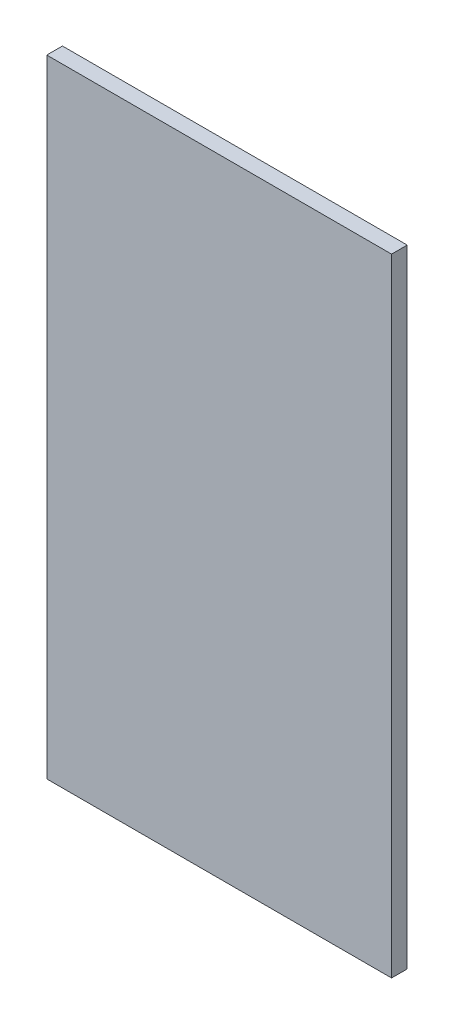
ISO-10303-21;
HEADER;
FILE_DESCRIPTION(('STEP AP214'),'2;1');
FILE_NAME('part.step','',(''),(''),'','','');
FILE_SCHEMA(('AUTOMOTIVE_DESIGN { 1 0 10303 214 1 1 1 1 }'));
ENDSEC;
DATA;
#1=APPLICATION_CONTEXT('core data for automotive mechanical design processes');
#2=APPLICATION_PROTOCOL_DEFINITION('international standard','automotive_design',2000,#1);
#3=PRODUCT_CONTEXT('',#1,'mechanical');
#4=PRODUCT('Part','Part','',(#3));
#5=PRODUCT_RELATED_PRODUCT_CATEGORY('part','',(#4));
#6=PRODUCT_DEFINITION_FORMATION('','',#4);
#7=PRODUCT_DEFINITION_CONTEXT('part definition',#1,'design');
#8=PRODUCT_DEFINITION('design','',#6,#7);
#9=PRODUCT_DEFINITION_SHAPE('','',#8);
#10=(LENGTH_UNIT() NAMED_UNIT(*) SI_UNIT(.MILLI.,.METRE.));
#11=(NAMED_UNIT(*) PLANE_ANGLE_UNIT() SI_UNIT($,.RADIAN.));
#12=(NAMED_UNIT(*) SI_UNIT($,.STERADIAN.) SOLID_ANGLE_UNIT());
#13=UNCERTAINTY_MEASURE_WITH_UNIT(LENGTH_MEASURE(1.E-05),#10,'distance_accuracy_value','');
#14=(GEOMETRIC_REPRESENTATION_CONTEXT(3) GLOBAL_UNCERTAINTY_ASSIGNED_CONTEXT((#13)) GLOBAL_UNIT_ASSIGNED_CONTEXT((#10,
#11,#12)) REPRESENTATION_CONTEXT('',''));
#15=CARTESIAN_POINT('',(0.,0.,0.));
#16=DIRECTION('',(0.,0.,1.));
#17=DIRECTION('',(1.,0.,0.));
#18=AXIS2_PLACEMENT_3D('',#15,#16,#17);
#19=CARTESIAN_POINT('',(110.,-200.,10.));
#20=DIRECTION('',(-1.,0.,0.));
#21=DIRECTION('',(0.,0.,1.));
#22=AXIS2_PLACEMENT_3D('',#19,#20,#21);
#23=PLANE('',#22);
#24=DIRECTION('',(0.,1.,0.));
#25=VECTOR('',#24,1.);
#26=CARTESIAN_POINT('',(110.,-200.,0.));
#27=LINE('',#26,#25);
#28=CARTESIAN_POINT('',(110.,-200.,0.));
#29=VERTEX_POINT('',#28);
#30=CARTESIAN_POINT('',(110.,200.,0.));
#31=VERTEX_POINT('',#30);
#32=EDGE_CURVE('E113',#29,#31,#27,.T.);
#33=ORIENTED_EDGE('',*,*,#32,.T.);
#34=DIRECTION('',(0.,0.,-1.));
#35=VECTOR('',#34,1.);
#36=CARTESIAN_POINT('',(110.,200.,10.));
#37=LINE('',#36,#35);
#38=CARTESIAN_POINT('',(110.,200.,10.));
#39=VERTEX_POINT('',#38);
#40=EDGE_CURVE('E11',#39,#31,#37,.T.);
#41=ORIENTED_EDGE('',*,*,#40,.F.);
#42=DIRECTION('',(0.,1.,0.));
#43=VECTOR('',#42,1.);
#44=CARTESIAN_POINT('',(110.,-200.,10.));
#45=LINE('',#44,#43);
#46=CARTESIAN_POINT('',(110.,-200.,10.));
#47=VERTEX_POINT('',#46);
#48=EDGE_CURVE('E97',#47,#39,#45,.T.);
#49=ORIENTED_EDGE('',*,*,#48,.F.);
#50=DIRECTION('',(0.,0.,-1.));
#51=VECTOR('',#50,1.);
#52=CARTESIAN_POINT('',(110.,-200.,10.));
#53=LINE('',#52,#51);
#54=EDGE_CURVE('E109',#47,#29,#53,.T.);
#55=ORIENTED_EDGE('',*,*,#54,.T.);
#56=EDGE_LOOP('',(#33,#41,#49,#55));
#57=FACE_BOUND('',#56,.T.);
#58=ADVANCED_FACE('F45',(#57),#23,.F.);
#59=CARTESIAN_POINT('',(-110.,200.,10.));
#60=DIRECTION('',(0.,-1.,0.));
#61=DIRECTION('',(0.,0.,-1.));
#62=AXIS2_PLACEMENT_3D('',#59,#60,#61);
#63=PLANE('',#62);
#64=DIRECTION('',(-1.,0.,0.));
#65=VECTOR('',#64,1.);
#66=CARTESIAN_POINT('',(-110.,200.,0.));
#67=LINE('',#66,#65);
#68=CARTESIAN_POINT('',(-110.,200.,0.));
#69=VERTEX_POINT('',#68);
#70=EDGE_CURVE('E102',#31,#69,#67,.T.);
#71=ORIENTED_EDGE('',*,*,#70,.T.);
#72=DIRECTION('',(0.,0.,-1.));
#73=VECTOR('',#72,1.);
#74=CARTESIAN_POINT('',(-110.,200.,10.));
#75=LINE('',#74,#73);
#76=CARTESIAN_POINT('',(-110.,200.,10.));
#77=VERTEX_POINT('',#76);
#78=EDGE_CURVE('E54',#77,#69,#75,.T.);
#79=ORIENTED_EDGE('',*,*,#78,.F.);
#80=DIRECTION('',(-1.,0.,0.));
#81=VECTOR('',#80,1.);
#82=CARTESIAN_POINT('',(-110.,200.,10.));
#83=LINE('',#82,#81);
#84=EDGE_CURVE('E92',#39,#77,#83,.T.);
#85=ORIENTED_EDGE('',*,*,#84,.F.);
#86=ORIENTED_EDGE('',*,*,#40,.T.);
#87=EDGE_LOOP('',(#71,#79,#85,#86));
#88=FACE_BOUND('',#87,.T.);
#89=ADVANCED_FACE('F101',(#88),#63,.F.);
#90=CARTESIAN_POINT('',(-110.,-200.,10.));
#91=DIRECTION('',(1.,0.,0.));
#92=DIRECTION('',(0.,0.,-1.));
#93=AXIS2_PLACEMENT_3D('',#90,#91,#92);
#94=PLANE('',#93);
#95=DIRECTION('',(0.,-1.,0.));
#96=VECTOR('',#95,1.);
#97=CARTESIAN_POINT('',(-110.,-200.,0.));
#98=LINE('',#97,#96);
#99=CARTESIAN_POINT('',(-110.,-200.,0.));
#100=VERTEX_POINT('',#99);
#101=EDGE_CURVE('E79',#69,#100,#98,.T.);
#102=ORIENTED_EDGE('',*,*,#101,.T.);
#103=DIRECTION('',(0.,0.,-1.));
#104=VECTOR('',#103,1.);
#105=CARTESIAN_POINT('',(-110.,-200.,10.));
#106=LINE('',#105,#104);
#107=CARTESIAN_POINT('',(-110.,-200.,10.));
#108=VERTEX_POINT('',#107);
#109=EDGE_CURVE('E104',#108,#100,#106,.T.);
#110=ORIENTED_EDGE('',*,*,#109,.F.);
#111=DIRECTION('',(0.,-1.,0.));
#112=VECTOR('',#111,1.);
#113=CARTESIAN_POINT('',(-110.,-200.,10.));
#114=LINE('',#113,#112);
#115=EDGE_CURVE('E95',#77,#108,#114,.T.);
#116=ORIENTED_EDGE('',*,*,#115,.F.);
#117=ORIENTED_EDGE('',*,*,#78,.T.);
#118=EDGE_LOOP('',(#102,#110,#116,#117));
#119=FACE_BOUND('',#118,.T.);
#120=ADVANCED_FACE('F105',(#119),#94,.F.);
#121=CARTESIAN_POINT('',(-110.,-200.,10.));
#122=DIRECTION('',(0.,1.,0.));
#123=DIRECTION('',(0.,0.,1.));
#124=AXIS2_PLACEMENT_3D('',#121,#122,#123);
#125=PLANE('',#124);
#126=DIRECTION('',(1.,0.,0.));
#127=VECTOR('',#126,1.);
#128=CARTESIAN_POINT('',(-110.,-200.,0.));
#129=LINE('',#128,#127);
#130=EDGE_CURVE('E85',#100,#29,#129,.T.);
#131=ORIENTED_EDGE('',*,*,#130,.T.);
#132=ORIENTED_EDGE('',*,*,#54,.F.);
#133=DIRECTION('',(1.,0.,0.));
#134=VECTOR('',#133,1.);
#135=CARTESIAN_POINT('',(-110.,-200.,10.));
#136=LINE('',#135,#134);
#137=EDGE_CURVE('E62',#108,#47,#136,.T.);
#138=ORIENTED_EDGE('',*,*,#137,.F.);
#139=ORIENTED_EDGE('',*,*,#109,.T.);
#140=EDGE_LOOP('',(#131,#132,#138,#139));
#141=FACE_BOUND('',#140,.T.);
#142=ADVANCED_FACE('F126',(#141),#125,.F.);
#143=CARTESIAN_POINT('',(0.,0.,10.));
#144=DIRECTION('',(0.,0.,-1.));
#145=DIRECTION('',(-1.,0.,0.));
#146=AXIS2_PLACEMENT_3D('',#143,#144,#145);
#147=PLANE('',#146);
#148=ORIENTED_EDGE('',*,*,#48,.T.);
#149=ORIENTED_EDGE('',*,*,#84,.T.);
#150=ORIENTED_EDGE('',*,*,#115,.T.);
#151=ORIENTED_EDGE('',*,*,#137,.T.);
#152=EDGE_LOOP('',(#148,#149,#150,#151));
#153=FACE_BOUND('',#152,.T.);
#154=ADVANCED_FACE('F93',(#153),#147,.F.);
#155=CARTESIAN_POINT('',(0.,0.,0.));
#156=DIRECTION('',(0.,0.,-1.));
#157=DIRECTION('',(-1.,0.,0.));
#158=AXIS2_PLACEMENT_3D('',#155,#156,#157);
#159=PLANE('',#158);
#160=ORIENTED_EDGE('',*,*,#32,.F.);
#161=ORIENTED_EDGE('',*,*,#130,.F.);
#162=ORIENTED_EDGE('',*,*,#101,.F.);
#163=ORIENTED_EDGE('',*,*,#70,.F.);
#164=EDGE_LOOP('',(#160,#161,#162,#163));
#165=FACE_BOUND('',#164,.T.);
#166=ADVANCED_FACE('F129',(#165),#159,.T.);
#167=CLOSED_SHELL('',(#58,#89,#120,#142,#154,#166));
#168=MANIFOLD_SOLID_BREP('B2',#167);
#169=ADVANCED_BREP_SHAPE_REPRESENTATION('',(#18,#168),#14);
#170=SHAPE_DEFINITION_REPRESENTATION(#9,#169);
ENDSEC;
END-ISO-10303-21;
